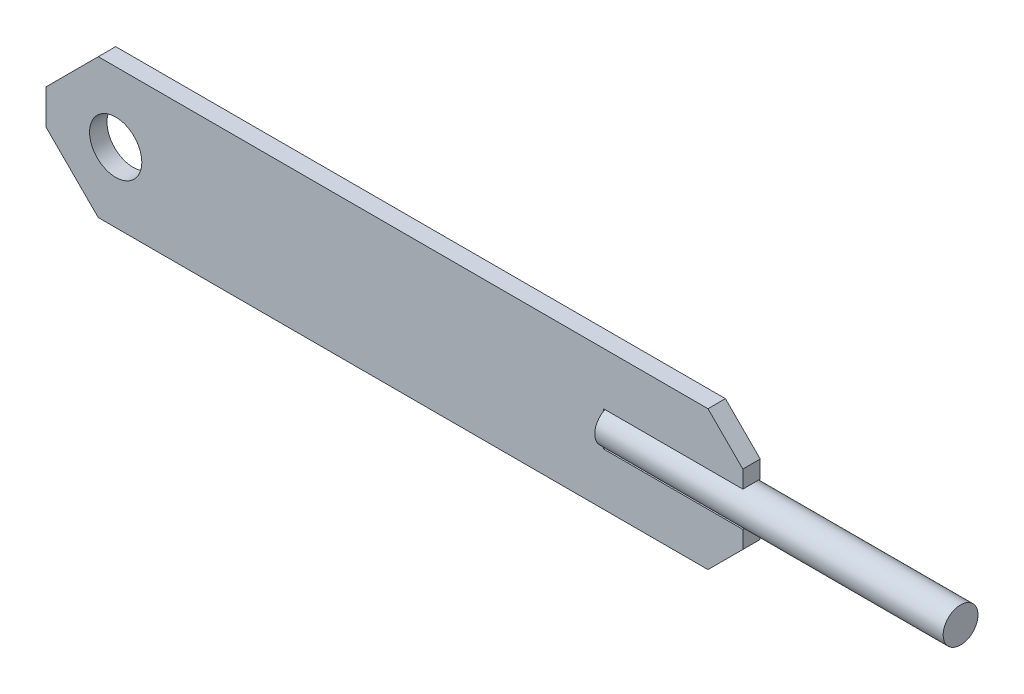
ISO-10303-21;
HEADER;
FILE_DESCRIPTION(('STEP AP214'),'2;1');
FILE_NAME('part.step','',(''),(''),'','','');
FILE_SCHEMA(('AUTOMOTIVE_DESIGN { 1 0 10303 214 1 1 1 1 }'));
ENDSEC;
DATA;
#1=APPLICATION_CONTEXT('core data for automotive mechanical design processes');
#2=APPLICATION_PROTOCOL_DEFINITION('international standard','automotive_design',2000,#1);
#3=PRODUCT_CONTEXT('',#1,'mechanical');
#4=PRODUCT('Part','Part','',(#3));
#5=PRODUCT_RELATED_PRODUCT_CATEGORY('part','',(#4));
#6=PRODUCT_DEFINITION_FORMATION('','',#4);
#7=PRODUCT_DEFINITION_CONTEXT('part definition',#1,'design');
#8=PRODUCT_DEFINITION('design','',#6,#7);
#9=PRODUCT_DEFINITION_SHAPE('','',#8);
#10=(LENGTH_UNIT() NAMED_UNIT(*) SI_UNIT(.MILLI.,.METRE.));
#11=(NAMED_UNIT(*) PLANE_ANGLE_UNIT() SI_UNIT($,.RADIAN.));
#12=(NAMED_UNIT(*) SI_UNIT($,.STERADIAN.) SOLID_ANGLE_UNIT());
#13=UNCERTAINTY_MEASURE_WITH_UNIT(LENGTH_MEASURE(1.E-05),#10,'distance_accuracy_value','');
#14=(GEOMETRIC_REPRESENTATION_CONTEXT(3) GLOBAL_UNCERTAINTY_ASSIGNED_CONTEXT((#13)) GLOBAL_UNIT_ASSIGNED_CONTEXT((#10,
#11,#12)) REPRESENTATION_CONTEXT('',''));
#15=CARTESIAN_POINT('',(0.,0.,0.));
#16=DIRECTION('',(0.,0.,1.));
#17=DIRECTION('',(1.,0.,0.));
#18=AXIS2_PLACEMENT_3D('',#15,#16,#17);
#19=CARTESIAN_POINT('',(320.,0.,0.));
#20=DIRECTION('',(-1.,0.,0.));
#21=DIRECTION('',(0.,0.,1.));
#22=AXIS2_PLACEMENT_3D('',#19,#20,#21);
#23=CYLINDRICAL_SURFACE('',#22,10.);
#24=CARTESIAN_POINT('',(320.,0.,0.));
#25=DIRECTION('',(1.,0.,0.));
#26=DIRECTION('',(0.,0.,-1.));
#27=AXIS2_PLACEMENT_3D('',#24,#25,#26);
#28=CIRCLE('',#27,10.);
#29=CARTESIAN_POINT('',(320.,0.,-10.));
#30=VERTEX_POINT('',#29);
#31=EDGE_CURVE('E11',#30,#30,#28,.T.);
#32=ORIENTED_EDGE('',*,*,#31,.F.);
#33=EDGE_LOOP('',(#32));
#34=FACE_BOUND('',#33,.T.);
#35=CARTESIAN_POINT('',(120.,0.,0.));
#36=DIRECTION('',(1.,0.,0.));
#37=DIRECTION('',(0.,0.,-1.));
#38=AXIS2_PLACEMENT_3D('',#35,#36,#37);
#39=CIRCLE('',#38,10.);
#40=CARTESIAN_POINT('',(120.,0.,-10.));
#41=VERTEX_POINT('',#40);
#42=EDGE_CURVE('E52',#41,#41,#39,.T.);
#43=ORIENTED_EDGE('',*,*,#42,.T.);
#44=EDGE_LOOP('',(#43));
#45=FACE_BOUND('',#44,.T.);
#46=ADVANCED_FACE('F49',(#34,#45),#23,.T.);
#47=CARTESIAN_POINT('',(320.,0.,0.));
#48=DIRECTION('',(1.,0.,0.));
#49=DIRECTION('',(0.,0.,-1.));
#50=AXIS2_PLACEMENT_3D('',#47,#48,#49);
#51=PLANE('',#50);
#52=ORIENTED_EDGE('',*,*,#31,.T.);
#53=EDGE_LOOP('',(#52));
#54=FACE_BOUND('',#53,.T.);
#55=ADVANCED_FACE('F64',(#54),#51,.T.);
#56=CARTESIAN_POINT('',(120.,0.,0.));
#57=DIRECTION('',(1.,0.,0.));
#58=DIRECTION('',(0.,0.,-1.));
#59=AXIS2_PLACEMENT_3D('',#56,#57,#58);
#60=PLANE('',#59);
#61=ORIENTED_EDGE('',*,*,#42,.F.);
#62=EDGE_LOOP('',(#61));
#63=FACE_BOUND('',#62,.T.);
#64=ADVANCED_FACE('F62',(#63),#60,.F.);
#65=CLOSED_SHELL('',(#46,#55,#64));
#66=MANIFOLD_SOLID_BREP('B2',#65);
#67=CARTESIAN_POINT('',(120.,0.,5.));
#68=DIRECTION('',(-1.,0.,0.));
#69=DIRECTION('',(0.,0.,1.));
#70=AXIS2_PLACEMENT_3D('',#67,#68,#69);
#71=PLANE('',#70);
#72=DIRECTION('',(0.,1.,0.));
#73=VECTOR('',#72,1.);
#74=CARTESIAN_POINT('',(120.,0.,-5.));
#75=LINE('',#74,#73);
#76=CARTESIAN_POINT('',(120.,-9.99999999999999,-5.));
#77=VERTEX_POINT('',#76);
#78=CARTESIAN_POINT('',(120.,10.,-5.));
#79=VERTEX_POINT('',#78);
#80=EDGE_CURVE('E203',#77,#79,#75,.T.);
#81=ORIENTED_EDGE('',*,*,#80,.T.);
#82=DIRECTION('',(0.,0.,-1.));
#83=VECTOR('',#82,1.);
#84=CARTESIAN_POINT('',(120.,10.,5.));
#85=LINE('',#84,#83);
#86=CARTESIAN_POINT('',(120.,10.,5.));
#87=VERTEX_POINT('',#86);
#88=EDGE_CURVE('E184',#87,#79,#85,.T.);
#89=ORIENTED_EDGE('',*,*,#88,.F.);
#90=DIRECTION('',(0.,1.,0.));
#91=VECTOR('',#90,1.);
#92=CARTESIAN_POINT('',(120.,0.,5.));
#93=LINE('',#92,#91);
#94=CARTESIAN_POINT('',(120.,-9.99999999999999,5.));
#95=VERTEX_POINT('',#94);
#96=EDGE_CURVE('E191',#95,#87,#93,.T.);
#97=ORIENTED_EDGE('',*,*,#96,.F.);
#98=DIRECTION('',(0.,0.,-1.));
#99=VECTOR('',#98,1.);
#100=CARTESIAN_POINT('',(120.,-9.99999999999999,5.));
#101=LINE('',#100,#99);
#102=EDGE_CURVE('E276',#95,#77,#101,.T.);
#103=ORIENTED_EDGE('',*,*,#102,.T.);
#104=EDGE_LOOP('',(#81,#89,#97,#103));
#105=FACE_BOUND('',#104,.T.);
#106=ADVANCED_FACE('F90',(#105),#71,.F.);
#107=CARTESIAN_POINT('',(0.,10.,5.));
#108=DIRECTION('',(0.,1.,0.));
#109=DIRECTION('',(0.,0.,1.));
#110=AXIS2_PLACEMENT_3D('',#107,#108,#109);
#111=PLANE('',#110);
#112=DIRECTION('',(1.,0.,0.));
#113=VECTOR('',#112,1.);
#114=CARTESIAN_POINT('',(0.,10.,-5.));
#115=LINE('',#114,#113);
#116=CARTESIAN_POINT('',(200.,10.,-5.));
#117=VERTEX_POINT('',#116);
#118=EDGE_CURVE('E307',#79,#117,#115,.T.);
#119=ORIENTED_EDGE('',*,*,#118,.T.);
#120=DIRECTION('',(0.,0.,-1.));
#121=VECTOR('',#120,1.);
#122=CARTESIAN_POINT('',(200.,10.,5.));
#123=LINE('',#122,#121);
#124=CARTESIAN_POINT('',(200.,10.,5.));
#125=VERTEX_POINT('',#124);
#126=EDGE_CURVE('E187',#125,#117,#123,.T.);
#127=ORIENTED_EDGE('',*,*,#126,.F.);
#128=DIRECTION('',(1.,0.,0.));
#129=VECTOR('',#128,1.);
#130=CARTESIAN_POINT('',(0.,10.,5.));
#131=LINE('',#130,#129);
#132=EDGE_CURVE('E180',#87,#125,#131,.T.);
#133=ORIENTED_EDGE('',*,*,#132,.F.);
#134=ORIENTED_EDGE('',*,*,#88,.T.);
#135=EDGE_LOOP('',(#119,#127,#133,#134));
#136=FACE_BOUND('',#135,.T.);
#137=ADVANCED_FACE('F182',(#136),#111,.F.);
#138=CARTESIAN_POINT('',(200.,0.,5.));
#139=DIRECTION('',(-1.,0.,0.));
#140=DIRECTION('',(0.,0.,1.));
#141=AXIS2_PLACEMENT_3D('',#138,#139,#140);
#142=PLANE('',#141);
#143=DIRECTION('',(0.,1.,0.));
#144=VECTOR('',#143,1.);
#145=CARTESIAN_POINT('',(200.,0.,-5.));
#146=LINE('',#145,#144);
#147=CARTESIAN_POINT('',(200.,20.,-5.));
#148=VERTEX_POINT('',#147);
#149=EDGE_CURVE('E304',#117,#148,#146,.T.);
#150=ORIENTED_EDGE('',*,*,#149,.T.);
#151=DIRECTION('',(0.,0.,-1.));
#152=VECTOR('',#151,1.);
#153=CARTESIAN_POINT('',(200.,20.,5.));
#154=LINE('',#153,#152);
#155=CARTESIAN_POINT('',(200.,20.,5.));
#156=VERTEX_POINT('',#155);
#157=EDGE_CURVE('E212',#156,#148,#154,.T.);
#158=ORIENTED_EDGE('',*,*,#157,.F.);
#159=DIRECTION('',(0.,1.,0.));
#160=VECTOR('',#159,1.);
#161=CARTESIAN_POINT('',(200.,0.,5.));
#162=LINE('',#161,#160);
#163=EDGE_CURVE('E190',#125,#156,#162,.T.);
#164=ORIENTED_EDGE('',*,*,#163,.F.);
#165=ORIENTED_EDGE('',*,*,#126,.T.);
#166=EDGE_LOOP('',(#150,#158,#164,#165));
#167=FACE_BOUND('',#166,.T.);
#168=ADVANCED_FACE('F305',(#167),#142,.F.);
#169=CARTESIAN_POINT('',(110.,110.,5.));
#170=DIRECTION('',(0.707106781186548,0.707106781186547,0.));
#171=DIRECTION('',(-0.707106781186547,0.707106781186548,0.));
#172=AXIS2_PLACEMENT_3D('',#169,#170,#171);
#173=PLANE('',#172);
#174=DIRECTION('',(0.707106781186547,-0.707106781186548,0.));
#175=VECTOR('',#174,1.);
#176=CARTESIAN_POINT('',(110.,110.,-5.));
#177=LINE('',#176,#175);
#178=CARTESIAN_POINT('',(180.,40.,-5.));
#179=VERTEX_POINT('',#178);
#180=EDGE_CURVE('E265',#179,#148,#177,.T.);
#181=ORIENTED_EDGE('',*,*,#180,.F.);
#182=DIRECTION('',(0.,0.,-1.));
#183=VECTOR('',#182,1.);
#184=CARTESIAN_POINT('',(180.,40.,5.));
#185=LINE('',#184,#183);
#186=CARTESIAN_POINT('',(180.,40.,5.));
#187=VERTEX_POINT('',#186);
#188=EDGE_CURVE('E288',#187,#179,#185,.T.);
#189=ORIENTED_EDGE('',*,*,#188,.F.);
#190=DIRECTION('',(0.707106781186547,-0.707106781186548,0.));
#191=VECTOR('',#190,1.);
#192=CARTESIAN_POINT('',(110.,110.,5.));
#193=LINE('',#192,#191);
#194=EDGE_CURVE('E301',#187,#156,#193,.T.);
#195=ORIENTED_EDGE('',*,*,#194,.T.);
#196=ORIENTED_EDGE('',*,*,#157,.T.);
#197=EDGE_LOOP('',(#181,#189,#195,#196));
#198=FACE_BOUND('',#197,.T.);
#199=ADVANCED_FACE('F297',(#198),#173,.T.);
#200=CARTESIAN_POINT('',(0.,40.,5.));
#201=DIRECTION('',(0.,1.,0.));
#202=DIRECTION('',(0.,0.,1.));
#203=AXIS2_PLACEMENT_3D('',#200,#201,#202);
#204=PLANE('',#203);
#205=DIRECTION('',(1.,0.,0.));
#206=VECTOR('',#205,1.);
#207=CARTESIAN_POINT('',(0.,40.,-5.));
#208=LINE('',#207,#206);
#209=CARTESIAN_POINT('',(-170.,40.,-5.));
#210=VERTEX_POINT('',#209);
#211=EDGE_CURVE('E259',#210,#179,#208,.T.);
#212=ORIENTED_EDGE('',*,*,#211,.F.);
#213=DIRECTION('',(0.,0.,1.));
#214=VECTOR('',#213,1.);
#215=CARTESIAN_POINT('',(-170.,40.,5.));
#216=LINE('',#215,#214);
#217=CARTESIAN_POINT('',(-170.,40.,5.));
#218=VERTEX_POINT('',#217);
#219=EDGE_CURVE('E47',#210,#218,#216,.T.);
#220=ORIENTED_EDGE('',*,*,#219,.T.);
#221=DIRECTION('',(1.,0.,0.));
#222=VECTOR('',#221,1.);
#223=CARTESIAN_POINT('',(0.,40.,5.));
#224=LINE('',#223,#222);
#225=EDGE_CURVE('E326',#218,#187,#224,.T.);
#226=ORIENTED_EDGE('',*,*,#225,.T.);
#227=ORIENTED_EDGE('',*,*,#188,.T.);
#228=EDGE_LOOP('',(#212,#220,#226,#227));
#229=FACE_BOUND('',#228,.T.);
#230=ADVANCED_FACE('F368',(#229),#204,.T.);
#231=CARTESIAN_POINT('',(-200.,0.,5.));
#232=DIRECTION('',(-1.,0.,0.));
#233=DIRECTION('',(0.,0.,1.));
#234=AXIS2_PLACEMENT_3D('',#231,#232,#233);
#235=PLANE('',#234);
#236=DIRECTION('',(0.,1.,0.));
#237=VECTOR('',#236,1.);
#238=CARTESIAN_POINT('',(-200.,0.,-5.));
#239=LINE('',#238,#237);
#240=CARTESIAN_POINT('',(-200.,-9.9999999999999,-5.));
#241=VERTEX_POINT('',#240);
#242=CARTESIAN_POINT('',(-200.,9.99999999999988,-5.));
#243=VERTEX_POINT('',#242);
#244=EDGE_CURVE('E252',#241,#243,#239,.T.);
#245=ORIENTED_EDGE('',*,*,#244,.F.);
#246=DIRECTION('',(0.,0.,1.));
#247=VECTOR('',#246,1.);
#248=CARTESIAN_POINT('',(-200.,-9.9999999999999,5.));
#249=LINE('',#248,#247);
#250=CARTESIAN_POINT('',(-200.,-9.9999999999999,5.));
#251=VERTEX_POINT('',#250);
#252=EDGE_CURVE('E225',#241,#251,#249,.T.);
#253=ORIENTED_EDGE('',*,*,#252,.T.);
#254=DIRECTION('',(0.,1.,0.));
#255=VECTOR('',#254,1.);
#256=CARTESIAN_POINT('',(-200.,0.,5.));
#257=LINE('',#256,#255);
#258=CARTESIAN_POINT('',(-200.,9.99999999999988,5.));
#259=VERTEX_POINT('',#258);
#260=EDGE_CURVE('E234',#251,#259,#257,.T.);
#261=ORIENTED_EDGE('',*,*,#260,.T.);
#262=DIRECTION('',(0.,0.,-1.));
#263=VECTOR('',#262,1.);
#264=CARTESIAN_POINT('',(-200.,9.99999999999988,5.));
#265=LINE('',#264,#263);
#266=EDGE_CURVE('E221',#259,#243,#265,.T.);
#267=ORIENTED_EDGE('',*,*,#266,.T.);
#268=EDGE_LOOP('',(#245,#253,#261,#267));
#269=FACE_BOUND('',#268,.T.);
#270=ADVANCED_FACE('F256',(#269),#235,.T.);
#271=CARTESIAN_POINT('',(0.,-40.,5.));
#272=DIRECTION('',(0.,1.,0.));
#273=DIRECTION('',(0.,0.,1.));
#274=AXIS2_PLACEMENT_3D('',#271,#272,#273);
#275=PLANE('',#274);
#276=DIRECTION('',(1.,0.,0.));
#277=VECTOR('',#276,1.);
#278=CARTESIAN_POINT('',(0.,-40.,5.));
#279=LINE('',#278,#277);
#280=CARTESIAN_POINT('',(-170.,-40.,5.));
#281=VERTEX_POINT('',#280);
#282=CARTESIAN_POINT('',(180.,-40.,5.));
#283=VERTEX_POINT('',#282);
#284=EDGE_CURVE('E232',#281,#283,#279,.T.);
#285=ORIENTED_EDGE('',*,*,#284,.F.);
#286=DIRECTION('',(0.,0.,-1.));
#287=VECTOR('',#286,1.);
#288=CARTESIAN_POINT('',(-170.,-40.,-5.));
#289=LINE('',#288,#287);
#290=CARTESIAN_POINT('',(-170.,-40.,-5.));
#291=VERTEX_POINT('',#290);
#292=EDGE_CURVE('E205',#281,#291,#289,.T.);
#293=ORIENTED_EDGE('',*,*,#292,.T.);
#294=DIRECTION('',(1.,0.,0.));
#295=VECTOR('',#294,1.);
#296=CARTESIAN_POINT('',(0.,-40.,-5.));
#297=LINE('',#296,#295);
#298=CARTESIAN_POINT('',(180.,-40.,-5.));
#299=VERTEX_POINT('',#298);
#300=EDGE_CURVE('E254',#291,#299,#297,.T.);
#301=ORIENTED_EDGE('',*,*,#300,.T.);
#302=DIRECTION('',(0.,0.,-1.));
#303=VECTOR('',#302,1.);
#304=CARTESIAN_POINT('',(180.,-40.,5.));
#305=LINE('',#304,#303);
#306=EDGE_CURVE('E242',#283,#299,#305,.T.);
#307=ORIENTED_EDGE('',*,*,#306,.F.);
#308=EDGE_LOOP('',(#285,#293,#301,#307));
#309=FACE_BOUND('',#308,.T.);
#310=ADVANCED_FACE('F239',(#309),#275,.F.);
#311=CARTESIAN_POINT('',(110.,-110.,5.));
#312=DIRECTION('',(-0.707106781186548,0.707106781186547,0.));
#313=DIRECTION('',(-0.707106781186547,-0.707106781186548,0.));
#314=AXIS2_PLACEMENT_3D('',#311,#312,#313);
#315=PLANE('',#314);
#316=DIRECTION('',(0.707106781186547,0.707106781186548,0.));
#317=VECTOR('',#316,1.);
#318=CARTESIAN_POINT('',(110.,-110.,-5.));
#319=LINE('',#318,#317);
#320=CARTESIAN_POINT('',(200.,-20.,-5.));
#321=VERTEX_POINT('',#320);
#322=EDGE_CURVE('E263',#299,#321,#319,.T.);
#323=ORIENTED_EDGE('',*,*,#322,.T.);
#324=DIRECTION('',(0.,0.,-1.));
#325=VECTOR('',#324,1.);
#326=CARTESIAN_POINT('',(200.,-20.,5.));
#327=LINE('',#326,#325);
#328=CARTESIAN_POINT('',(200.,-20.,5.));
#329=VERTEX_POINT('',#328);
#330=EDGE_CURVE('E282',#329,#321,#327,.T.);
#331=ORIENTED_EDGE('',*,*,#330,.F.);
#332=DIRECTION('',(0.707106781186547,0.707106781186548,0.));
#333=VECTOR('',#332,1.);
#334=CARTESIAN_POINT('',(110.,-110.,5.));
#335=LINE('',#334,#333);
#336=EDGE_CURVE('E245',#283,#329,#335,.T.);
#337=ORIENTED_EDGE('',*,*,#336,.F.);
#338=ORIENTED_EDGE('',*,*,#306,.T.);
#339=EDGE_LOOP('',(#323,#331,#337,#338));
#340=FACE_BOUND('',#339,.T.);
#341=ADVANCED_FACE('F379',(#340),#315,.F.);
#342=CARTESIAN_POINT('',(200.,-9.99999999999999,-5.));
#343=VERTEX_POINT('',#342);
#344=EDGE_CURVE('E271',#321,#343,#146,.T.);
#345=ORIENTED_EDGE('',*,*,#344,.T.);
#346=DIRECTION('',(0.,0.,-1.));
#347=VECTOR('',#346,1.);
#348=CARTESIAN_POINT('',(200.,-9.99999999999999,5.));
#349=LINE('',#348,#347);
#350=CARTESIAN_POINT('',(200.,-9.99999999999999,5.));
#351=VERTEX_POINT('',#350);
#352=EDGE_CURVE('E279',#351,#343,#349,.T.);
#353=ORIENTED_EDGE('',*,*,#352,.F.);
#354=EDGE_CURVE('E321',#329,#351,#162,.T.);
#355=ORIENTED_EDGE('',*,*,#354,.F.);
#356=ORIENTED_EDGE('',*,*,#330,.T.);
#357=EDGE_LOOP('',(#345,#353,#355,#356));
#358=FACE_BOUND('',#357,.T.);
#359=ADVANCED_FACE('F360',(#358),#142,.F.);
#360=CARTESIAN_POINT('',(-160.,0.,5.));
#361=DIRECTION('',(0.,0.,-1.));
#362=DIRECTION('',(-1.,0.,0.));
#363=AXIS2_PLACEMENT_3D('',#360,#361,#362);
#364=CYLINDRICAL_SURFACE('',#363,15.);
#365=CARTESIAN_POINT('',(-160.,0.,5.));
#366=DIRECTION('',(0.,0.,1.));
#367=DIRECTION('',(1.,0.,0.));
#368=AXIS2_PLACEMENT_3D('',#365,#366,#367);
#369=CIRCLE('',#368,15.);
#370=CARTESIAN_POINT('',(-145.,0.,5.));
#371=VERTEX_POINT('',#370);
#372=EDGE_CURVE('E200',#371,#371,#369,.T.);
#373=ORIENTED_EDGE('',*,*,#372,.T.);
#374=EDGE_LOOP('',(#373));
#375=FACE_BOUND('',#374,.T.);
#376=CARTESIAN_POINT('',(-160.,0.,-5.));
#377=DIRECTION('',(0.,0.,1.));
#378=DIRECTION('',(1.,0.,0.));
#379=AXIS2_PLACEMENT_3D('',#376,#377,#378);
#380=CIRCLE('',#379,15.);
#381=CARTESIAN_POINT('',(-145.,0.,-5.));
#382=VERTEX_POINT('',#381);
#383=EDGE_CURVE('E315',#382,#382,#380,.T.);
#384=ORIENTED_EDGE('',*,*,#383,.F.);
#385=EDGE_LOOP('',(#384));
#386=FACE_BOUND('',#385,.T.);
#387=ADVANCED_FACE('F337',(#375,#386),#364,.F.);
#388=CARTESIAN_POINT('',(0.,-9.99999999999999,5.));
#389=DIRECTION('',(0.,1.,0.));
#390=DIRECTION('',(0.,0.,1.));
#391=AXIS2_PLACEMENT_3D('',#388,#389,#390);
#392=PLANE('',#391);
#393=DIRECTION('',(1.,0.,0.));
#394=VECTOR('',#393,1.);
#395=CARTESIAN_POINT('',(0.,-9.99999999999999,-5.));
#396=LINE('',#395,#394);
#397=EDGE_CURVE('E272',#77,#343,#396,.T.);
#398=ORIENTED_EDGE('',*,*,#397,.F.);
#399=ORIENTED_EDGE('',*,*,#102,.F.);
#400=DIRECTION('',(1.,0.,0.));
#401=VECTOR('',#400,1.);
#402=CARTESIAN_POINT('',(0.,-9.99999999999999,5.));
#403=LINE('',#402,#401);
#404=EDGE_CURVE('E197',#95,#351,#403,.T.);
#405=ORIENTED_EDGE('',*,*,#404,.T.);
#406=ORIENTED_EDGE('',*,*,#352,.T.);
#407=EDGE_LOOP('',(#398,#399,#405,#406));
#408=FACE_BOUND('',#407,.T.);
#409=ADVANCED_FACE('F341',(#408),#392,.T.);
#410=CARTESIAN_POINT('',(0.,0.,5.));
#411=DIRECTION('',(0.,0.,1.));
#412=DIRECTION('',(1.,0.,0.));
#413=AXIS2_PLACEMENT_3D('',#410,#411,#412);
#414=PLANE('',#413);
#415=ORIENTED_EDGE('',*,*,#372,.F.);
#416=EDGE_LOOP('',(#415));
#417=FACE_BOUND('',#416,.T.);
#418=ORIENTED_EDGE('',*,*,#260,.F.);
#419=DIRECTION('',(0.707106781186548,-0.707106781186548,0.));
#420=VECTOR('',#419,1.);
#421=CARTESIAN_POINT('',(-105.,-105.,5.));
#422=LINE('',#421,#420);
#423=EDGE_CURVE('E99',#251,#281,#422,.T.);
#424=ORIENTED_EDGE('',*,*,#423,.T.);
#425=ORIENTED_EDGE('',*,*,#284,.T.);
#426=ORIENTED_EDGE('',*,*,#336,.T.);
#427=ORIENTED_EDGE('',*,*,#354,.T.);
#428=ORIENTED_EDGE('',*,*,#404,.F.);
#429=ORIENTED_EDGE('',*,*,#96,.T.);
#430=ORIENTED_EDGE('',*,*,#132,.T.);
#431=ORIENTED_EDGE('',*,*,#163,.T.);
#432=ORIENTED_EDGE('',*,*,#194,.F.);
#433=ORIENTED_EDGE('',*,*,#225,.F.);
#434=DIRECTION('',(0.707106781186548,0.707106781186548,0.));
#435=VECTOR('',#434,1.);
#436=CARTESIAN_POINT('',(-105.,105.,5.));
#437=LINE('',#436,#435);
#438=EDGE_CURVE('E111',#218,#259,#437,.F.);
#439=ORIENTED_EDGE('',*,*,#438,.T.);
#440=EDGE_LOOP('',(#418,#424,#425,#426,#427,#428,#429,#430,#431,#432,#433,#439));
#441=FACE_BOUND('',#440,.T.);
#442=ADVANCED_FACE('F195',(#417,#441),#414,.T.);
#443=CARTESIAN_POINT('',(0.,0.,-5.));
#444=DIRECTION('',(0.,0.,1.));
#445=DIRECTION('',(1.,0.,0.));
#446=AXIS2_PLACEMENT_3D('',#443,#444,#445);
#447=PLANE('',#446);
#448=ORIENTED_EDGE('',*,*,#383,.T.);
#449=EDGE_LOOP('',(#448));
#450=FACE_BOUND('',#449,.T.);
#451=ORIENTED_EDGE('',*,*,#300,.F.);
#452=DIRECTION('',(-0.707106781186548,0.707106781186548,0.));
#453=VECTOR('',#452,1.);
#454=CARTESIAN_POINT('',(-170.,-40.,-5.));
#455=LINE('',#454,#453);
#456=EDGE_CURVE('E218',#291,#241,#455,.T.);
#457=ORIENTED_EDGE('',*,*,#456,.T.);
#458=ORIENTED_EDGE('',*,*,#244,.T.);
#459=DIRECTION('',(-0.707106781186548,-0.707106781186548,0.));
#460=VECTOR('',#459,1.);
#461=CARTESIAN_POINT('',(-200.,9.99999999999988,-5.));
#462=LINE('',#461,#460);
#463=EDGE_CURVE('E210',#243,#210,#462,.F.);
#464=ORIENTED_EDGE('',*,*,#463,.T.);
#465=ORIENTED_EDGE('',*,*,#211,.T.);
#466=ORIENTED_EDGE('',*,*,#180,.T.);
#467=ORIENTED_EDGE('',*,*,#149,.F.);
#468=ORIENTED_EDGE('',*,*,#118,.F.);
#469=ORIENTED_EDGE('',*,*,#80,.F.);
#470=ORIENTED_EDGE('',*,*,#397,.T.);
#471=ORIENTED_EDGE('',*,*,#344,.F.);
#472=ORIENTED_EDGE('',*,*,#322,.F.);
#473=EDGE_LOOP('',(#451,#457,#458,#464,#465,#466,#467,#468,#469,#470,#471,#472));
#474=FACE_BOUND('',#473,.T.);
#475=ADVANCED_FACE('F251',(#450,#474),#447,.F.);
#476=CARTESIAN_POINT('',(-170.,-40.,5.));
#477=DIRECTION('',(-0.707106781186547,-0.707106781186547,0.));
#478=DIRECTION('',(0.,0.,1.));
#479=AXIS2_PLACEMENT_3D('',#476,#477,#478);
#480=PLANE('',#479);
#481=ORIENTED_EDGE('',*,*,#423,.F.);
#482=ORIENTED_EDGE('',*,*,#252,.F.);
#483=ORIENTED_EDGE('',*,*,#456,.F.);
#484=ORIENTED_EDGE('',*,*,#292,.F.);
#485=EDGE_LOOP('',(#481,#482,#483,#484));
#486=FACE_BOUND('',#485,.T.);
#487=ADVANCED_FACE('F247',(#486),#480,.T.);
#488=CARTESIAN_POINT('',(-200.,9.99999999999988,5.));
#489=DIRECTION('',(0.707106781186547,-0.707106781186547,0.));
#490=DIRECTION('',(0.,0.,-1.));
#491=AXIS2_PLACEMENT_3D('',#488,#489,#490);
#492=PLANE('',#491);
#493=ORIENTED_EDGE('',*,*,#438,.F.);
#494=ORIENTED_EDGE('',*,*,#219,.F.);
#495=ORIENTED_EDGE('',*,*,#463,.F.);
#496=ORIENTED_EDGE('',*,*,#266,.F.);
#497=EDGE_LOOP('',(#493,#494,#495,#496));
#498=FACE_BOUND('',#497,.T.);
#499=ADVANCED_FACE('F92',(#498),#492,.F.);
#500=CLOSED_SHELL('',(#106,#137,#168,#199,#230,#270,#310,#341,#359,#387,#409,#442,#475,#487,#499));
#501=MANIFOLD_SOLID_BREP('B6',#500);
#502=ADVANCED_BREP_SHAPE_REPRESENTATION('',(#18,#66,#501),#14);
#503=SHAPE_DEFINITION_REPRESENTATION(#9,#502);
ENDSEC;
END-ISO-10303-21;
